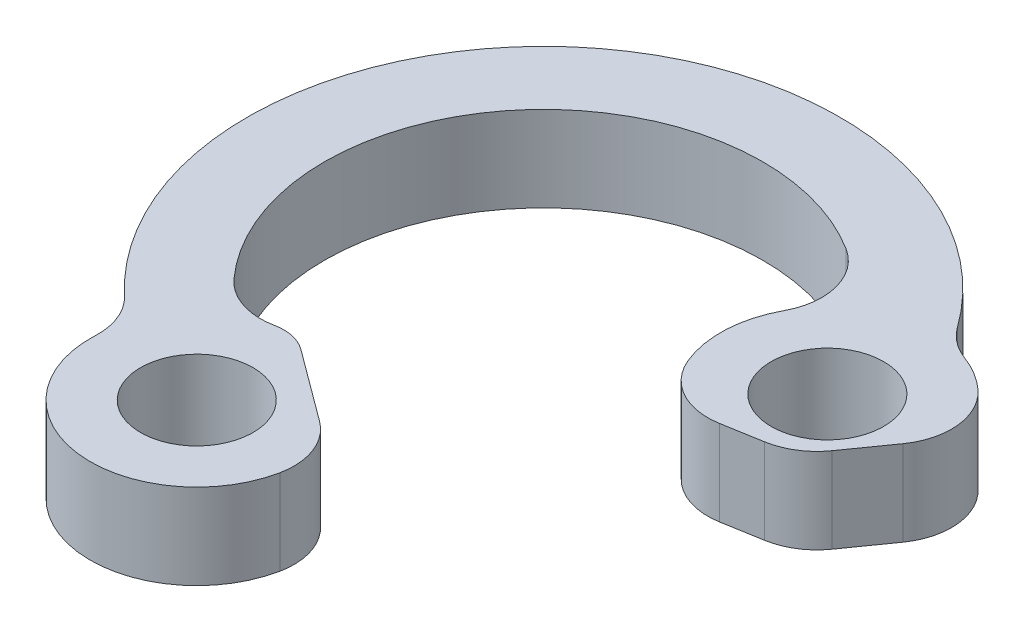
ISO-10303-21;
HEADER;
FILE_DESCRIPTION(('STEP AP214'),'2;1');
FILE_NAME('part.step','',(''),(''),'','','');
FILE_SCHEMA(('AUTOMOTIVE_DESIGN { 1 0 10303 214 1 1 1 1 }'));
ENDSEC;
DATA;
#1=APPLICATION_CONTEXT('core data for automotive mechanical design processes');
#2=APPLICATION_PROTOCOL_DEFINITION('international standard','automotive_design',2000,#1);
#3=PRODUCT_CONTEXT('',#1,'mechanical');
#4=PRODUCT('Part','Part','',(#3));
#5=PRODUCT_RELATED_PRODUCT_CATEGORY('part','',(#4));
#6=PRODUCT_DEFINITION_FORMATION('','',#4);
#7=PRODUCT_DEFINITION_CONTEXT('part definition',#1,'design');
#8=PRODUCT_DEFINITION('design','',#6,#7);
#9=PRODUCT_DEFINITION_SHAPE('','',#8);
#10=(LENGTH_UNIT() NAMED_UNIT(*) SI_UNIT(.MILLI.,.METRE.));
#11=(NAMED_UNIT(*) PLANE_ANGLE_UNIT() SI_UNIT($,.RADIAN.));
#12=(NAMED_UNIT(*) SI_UNIT($,.STERADIAN.) SOLID_ANGLE_UNIT());
#13=UNCERTAINTY_MEASURE_WITH_UNIT(LENGTH_MEASURE(1.E-05),#10,'distance_accuracy_value','');
#14=(GEOMETRIC_REPRESENTATION_CONTEXT(3) GLOBAL_UNCERTAINTY_ASSIGNED_CONTEXT((#13)) GLOBAL_UNIT_ASSIGNED_CONTEXT((#10,
#11,#12)) REPRESENTATION_CONTEXT('',''));
#15=CARTESIAN_POINT('',(0.,0.,0.));
#16=DIRECTION('',(0.,0.,1.));
#17=DIRECTION('',(1.,0.,0.));
#18=AXIS2_PLACEMENT_3D('',#15,#16,#17);
#19=CARTESIAN_POINT('',(70.7257143841729,0.,-73.8122286185501));
#20=DIRECTION('',(0.,1.,0.));
#21=DIRECTION('',(0.,0.,1.));
#22=AXIS2_PLACEMENT_3D('',#19,#20,#21);
#23=CYLINDRICAL_SURFACE('',#22,3.);
#24=CARTESIAN_POINT('',(70.7257143841729,4.,-73.8122286185501));
#25=DIRECTION('',(0.,-1.,0.));
#26=DIRECTION('',(0.,0.,-1.));
#27=AXIS2_PLACEMENT_3D('',#24,#25,#26);
#28=CIRCLE('',#27,3.);
#29=CARTESIAN_POINT('',(71.3263935959705,4.,-70.872979652485));
#30=VERTEX_POINT('',#29);
#31=CARTESIAN_POINT('',(68.4970170332679,4.,-71.8040184407876));
#32=VERTEX_POINT('',#31);
#33=EDGE_CURVE('E184',#30,#32,#28,.T.);
#34=ORIENTED_EDGE('',*,*,#33,.F.);
#35=DIRECTION('',(0.,1.,0.));
#36=VECTOR('',#35,1.);
#37=CARTESIAN_POINT('',(71.3263935959705,0.,-70.872979652485));
#38=LINE('',#37,#36);
#39=CARTESIAN_POINT('',(71.3263935959705,0.,-70.872979652485));
#40=VERTEX_POINT('',#39);
#41=EDGE_CURVE('E11',#40,#30,#38,.T.);
#42=ORIENTED_EDGE('',*,*,#41,.F.);
#43=CARTESIAN_POINT('',(70.7257143841729,0.,-73.8122286185501));
#44=DIRECTION('',(0.,-1.,0.));
#45=DIRECTION('',(0.,0.,-1.));
#46=AXIS2_PLACEMENT_3D('',#43,#44,#45);
#47=CIRCLE('',#46,3.);
#48=CARTESIAN_POINT('',(68.4970170332679,0.,-71.8040184407876));
#49=VERTEX_POINT('',#48);
#50=EDGE_CURVE('E232',#40,#49,#47,.T.);
#51=ORIENTED_EDGE('',*,*,#50,.T.);
#52=DIRECTION('',(0.,1.,0.));
#53=VECTOR('',#52,1.);
#54=CARTESIAN_POINT('',(68.4970170332679,0.,-71.8040184407876));
#55=LINE('',#54,#53);
#56=EDGE_CURVE('E36',#49,#32,#55,.T.);
#57=ORIENTED_EDGE('',*,*,#56,.T.);
#58=EDGE_LOOP('',(#34,#42,#51,#57));
#59=FACE_BOUND('',#58,.T.);
#60=ADVANCED_FACE('F33',(#59),#23,.F.);
#61=CARTESIAN_POINT('',(71.7268464038356,0.,-68.913480341775));
#62=DIRECTION('',(0.,1.,0.));
#63=DIRECTION('',(0.,0.,1.));
#64=AXIS2_PLACEMENT_3D('',#61,#62,#63);
#65=CYLINDRICAL_SURFACE('',#64,2.);
#66=CARTESIAN_POINT('',(71.7268464038356,4.,-68.913480341775));
#67=DIRECTION('',(0.,1.,0.));
#68=DIRECTION('',(0.,0.,1.));
#69=AXIS2_PLACEMENT_3D('',#66,#67,#68);
#70=CIRCLE('',#69,2.);
#71=CARTESIAN_POINT('',(72.9156523362013,4.,-70.5218150255931));
#72=VERTEX_POINT('',#71);
#73=EDGE_CURVE('E230',#72,#30,#70,.T.);
#74=ORIENTED_EDGE('',*,*,#73,.F.);
#75=DIRECTION('',(0.,1.,0.));
#76=VECTOR('',#75,1.);
#77=CARTESIAN_POINT('',(72.9156523362013,0.,-70.5218150255931));
#78=LINE('',#77,#76);
#79=CARTESIAN_POINT('',(72.9156523362013,0.,-70.5218150255931));
#80=VERTEX_POINT('',#79);
#81=EDGE_CURVE('E42',#80,#72,#78,.T.);
#82=ORIENTED_EDGE('',*,*,#81,.F.);
#83=CARTESIAN_POINT('',(71.7268464038356,0.,-68.913480341775));
#84=DIRECTION('',(0.,1.,0.));
#85=DIRECTION('',(0.,0.,1.));
#86=AXIS2_PLACEMENT_3D('',#83,#84,#85);
#87=CIRCLE('',#86,2.);
#88=EDGE_CURVE('E174',#80,#40,#87,.T.);
#89=ORIENTED_EDGE('',*,*,#88,.T.);
#90=ORIENTED_EDGE('',*,*,#41,.T.);
#91=EDGE_LOOP('',(#74,#82,#89,#90));
#92=FACE_BOUND('',#91,.T.);
#93=ADVANCED_FACE('F262',(#92),#65,.T.);
#94=CARTESIAN_POINT('',(76.2816528178536,0.,-68.0338245711221));
#95=DIRECTION('',(0.594402966182842,0.,-0.804167341909033));
#96=DIRECTION('',(-0.804167341909033,0.,-0.594402966182842));
#97=AXIS2_PLACEMENT_3D('',#94,#95,#96);
#98=PLANE('',#97);
#99=DIRECTION('',(-0.804167341909033,0.,-0.594402966182842));
#100=VECTOR('',#99,1.);
#101=CARTESIAN_POINT('',(76.2816528178536,4.,-68.0338245711221));
#102=LINE('',#101,#100);
#103=CARTESIAN_POINT('',(76.2816528178536,4.,-68.0338245711221));
#104=VERTEX_POINT('',#103);
#105=EDGE_CURVE('E161',#104,#72,#102,.T.);
#106=ORIENTED_EDGE('',*,*,#105,.F.);
#107=DIRECTION('',(0.,1.,0.));
#108=VECTOR('',#107,1.);
#109=CARTESIAN_POINT('',(76.2816528178536,0.,-68.0338245711221));
#110=LINE('',#109,#108);
#111=CARTESIAN_POINT('',(76.2816528178536,0.,-68.0338245711221));
#112=VERTEX_POINT('',#111);
#113=EDGE_CURVE('E156',#112,#104,#110,.T.);
#114=ORIENTED_EDGE('',*,*,#113,.F.);
#115=DIRECTION('',(-0.804167341909033,0.,-0.594402966182842));
#116=VECTOR('',#115,1.);
#117=CARTESIAN_POINT('',(76.2816528178536,0.,-68.0338245711221));
#118=LINE('',#117,#116);
#119=EDGE_CURVE('E159',#112,#80,#118,.T.);
#120=ORIENTED_EDGE('',*,*,#119,.T.);
#121=ORIENTED_EDGE('',*,*,#81,.T.);
#122=EDGE_LOOP('',(#106,#114,#120,#121));
#123=FACE_BOUND('',#122,.T.);
#124=ADVANCED_FACE('F158',(#123),#98,.T.);
#125=CARTESIAN_POINT('',(74.4984439193051,0.,-65.621322545395));
#126=DIRECTION('',(0.,1.,0.));
#127=DIRECTION('',(0.,0.,1.));
#128=AXIS2_PLACEMENT_3D('',#125,#126,#127);
#129=CYLINDRICAL_SURFACE('',#128,3.);
#130=CARTESIAN_POINT('',(74.4984439193051,4.,-65.621322545395));
#131=DIRECTION('',(0.,1.,0.));
#132=DIRECTION('',(0.,0.,1.));
#133=AXIS2_PLACEMENT_3D('',#130,#131,#132);
#134=CIRCLE('',#133,3.);
#135=CARTESIAN_POINT('',(77.4381265050103,4.,-65.0227690429395));
#136=VERTEX_POINT('',#135);
#137=EDGE_CURVE('E227',#136,#104,#134,.T.);
#138=ORIENTED_EDGE('',*,*,#137,.F.);
#139=DIRECTION('',(0.,1.,0.));
#140=VECTOR('',#139,1.);
#141=CARTESIAN_POINT('',(77.4381265050103,0.,-65.0227690429395));
#142=LINE('',#141,#140);
#143=CARTESIAN_POINT('',(77.4381265050103,0.,-65.0227690429395));
#144=VERTEX_POINT('',#143);
#145=EDGE_CURVE('E166',#144,#136,#142,.T.);
#146=ORIENTED_EDGE('',*,*,#145,.F.);
#147=CARTESIAN_POINT('',(74.4984439193051,0.,-65.621322545395));
#148=DIRECTION('',(0.,1.,0.));
#149=DIRECTION('',(0.,0.,1.));
#150=AXIS2_PLACEMENT_3D('',#147,#148,#149);
#151=CIRCLE('',#150,3.);
#152=EDGE_CURVE('E172',#144,#112,#151,.T.);
#153=ORIENTED_EDGE('',*,*,#152,.T.);
#154=ORIENTED_EDGE('',*,*,#113,.T.);
#155=EDGE_LOOP('',(#138,#146,#153,#154));
#156=FACE_BOUND('',#155,.T.);
#157=ADVANCED_FACE('F176',(#156),#129,.T.);
#158=CARTESIAN_POINT('',(72.5386555288346,0.,-66.0203582136987));
#159=DIRECTION('',(0.,1.,0.));
#160=DIRECTION('',(0.,0.,1.));
#161=AXIS2_PLACEMENT_3D('',#158,#159,#160);
#162=CYLINDRICAL_SURFACE('',#161,5.00000000000039);
#163=CARTESIAN_POINT('',(72.5386555288346,4.,-66.0203582136987));
#164=DIRECTION('',(0.,1.,0.));
#165=DIRECTION('',(0.,0.,1.));
#166=AXIS2_PLACEMENT_3D('',#163,#164,#165);
#167=CIRCLE('',#166,5.00000000000039);
#168=CARTESIAN_POINT('',(67.5438448545859,4.,-66.2481000157799));
#169=VERTEX_POINT('',#168);
#170=EDGE_CURVE('E224',#169,#136,#167,.T.);
#171=ORIENTED_EDGE('',*,*,#170,.F.);
#172=DIRECTION('',(0.,1.,0.));
#173=VECTOR('',#172,1.);
#174=CARTESIAN_POINT('',(67.5438448545859,0.,-66.2481000157799));
#175=LINE('',#174,#173);
#176=CARTESIAN_POINT('',(67.5438448545859,0.,-66.2481000157799));
#177=VERTEX_POINT('',#176);
#178=EDGE_CURVE('E236',#177,#169,#175,.T.);
#179=ORIENTED_EDGE('',*,*,#178,.F.);
#180=CARTESIAN_POINT('',(72.5386555288346,0.,-66.0203582136987));
#181=DIRECTION('',(0.,1.,0.));
#182=DIRECTION('',(0.,0.,1.));
#183=AXIS2_PLACEMENT_3D('',#180,#181,#182);
#184=CIRCLE('',#183,5.00000000000039);
#185=EDGE_CURVE('E177',#177,#144,#184,.T.);
#186=ORIENTED_EDGE('',*,*,#185,.T.);
#187=ORIENTED_EDGE('',*,*,#145,.T.);
#188=EDGE_LOOP('',(#171,#179,#186,#187));
#189=FACE_BOUND('',#188,.T.);
#190=ADVANCED_FACE('F275',(#189),#162,.T.);
#191=CARTESIAN_POINT('',(64.5469584500369,0.,-66.3847450970286));
#192=DIRECTION('',(0.,1.,0.));
#193=DIRECTION('',(0.,0.,1.));
#194=AXIS2_PLACEMENT_3D('',#191,#192,#193);
#195=CYLINDRICAL_SURFACE('',#194,3.);
#196=CARTESIAN_POINT('',(64.5469584500369,4.,-66.3847450970286));
#197=DIRECTION('',(0.,-1.,0.));
#198=DIRECTION('',(0.,0.,-1.));
#199=AXIS2_PLACEMENT_3D('',#196,#197,#198);
#200=CIRCLE('',#199,3.);
#201=CARTESIAN_POINT('',(66.6039727055924,4.,-68.5684786779494));
#202=VERTEX_POINT('',#201);
#203=EDGE_CURVE('E221',#202,#169,#200,.T.);
#204=ORIENTED_EDGE('',*,*,#203,.F.);
#205=DIRECTION('',(0.,1.,0.));
#206=VECTOR('',#205,1.);
#207=CARTESIAN_POINT('',(66.6039727055924,0.,-68.5684786779494));
#208=LINE('',#207,#206);
#209=CARTESIAN_POINT('',(66.6039727055924,0.,-68.5684786779494));
#210=VERTEX_POINT('',#209);
#211=EDGE_CURVE('E238',#210,#202,#208,.T.);
#212=ORIENTED_EDGE('',*,*,#211,.F.);
#213=CARTESIAN_POINT('',(64.5469584500369,0.,-66.3847450970286));
#214=DIRECTION('',(0.,-1.,0.));
#215=DIRECTION('',(0.,0.,-1.));
#216=AXIS2_PLACEMENT_3D('',#213,#214,#215);
#217=CIRCLE('',#216,3.);
#218=EDGE_CURVE('E179',#210,#177,#217,.T.);
#219=ORIENTED_EDGE('',*,*,#218,.T.);
#220=ORIENTED_EDGE('',*,*,#178,.T.);
#221=EDGE_LOOP('',(#204,#212,#219,#220));
#222=FACE_BOUND('',#221,.T.);
#223=ADVANCED_FACE('F278',(#222),#195,.F.);
#224=CARTESIAN_POINT('',(76.133240695646,0.,-78.6847831494777));
#225=DIRECTION('',(0.,1.,0.));
#226=DIRECTION('',(0.,0.,1.));
#227=AXIS2_PLACEMENT_3D('',#224,#225,#226);
#228=CYLINDRICAL_SURFACE('',#227,13.8977179632817);
#229=CARTESIAN_POINT('',(76.133240695646,4.,-78.6847831494777));
#230=DIRECTION('',(0.,1.,0.));
#231=DIRECTION('',(0.,0.,1.));
#232=AXIS2_PLACEMENT_3D('',#229,#230,#231);
#233=CIRCLE('',#232,13.8977179632817);
#234=CARTESIAN_POINT('',(87.417993221366,4.,-86.7965600830589));
#235=VERTEX_POINT('',#234);
#236=EDGE_CURVE('E218',#235,#202,#233,.T.);
#237=ORIENTED_EDGE('',*,*,#236,.F.);
#238=DIRECTION('',(0.,1.,0.));
#239=VECTOR('',#238,1.);
#240=CARTESIAN_POINT('',(87.417993221366,0.,-86.7965600830589));
#241=LINE('',#240,#239);
#242=CARTESIAN_POINT('',(87.417993221366,0.,-86.7965600830589));
#243=VERTEX_POINT('',#242);
#244=EDGE_CURVE('E240',#243,#235,#241,.T.);
#245=ORIENTED_EDGE('',*,*,#244,.F.);
#246=CARTESIAN_POINT('',(76.133240695646,0.,-78.6847831494777));
#247=DIRECTION('',(0.,1.,0.));
#248=DIRECTION('',(0.,0.,1.));
#249=AXIS2_PLACEMENT_3D('',#246,#247,#248);
#250=CIRCLE('',#249,13.8977179632817);
#251=EDGE_CURVE('E387',#243,#210,#250,.T.);
#252=ORIENTED_EDGE('',*,*,#251,.T.);
#253=ORIENTED_EDGE('',*,*,#211,.T.);
#254=EDGE_LOOP('',(#237,#245,#252,#253));
#255=FACE_BOUND('',#254,.T.);
#256=ADVANCED_FACE('F282',(#255),#228,.T.);
#257=CARTESIAN_POINT('',(89.85395124459,0.,-88.5475907821304));
#258=DIRECTION('',(0.,1.,0.));
#259=DIRECTION('',(0.,0.,1.));
#260=AXIS2_PLACEMENT_3D('',#257,#258,#259);
#261=CYLINDRICAL_SURFACE('',#260,3.);
#262=CARTESIAN_POINT('',(89.85395124459,4.,-88.5475907821304));
#263=DIRECTION('',(0.,-1.,0.));
#264=DIRECTION('',(0.,0.,-1.));
#265=AXIS2_PLACEMENT_3D('',#262,#263,#264);
#266=CIRCLE('',#265,3.);
#267=CARTESIAN_POINT('',(88.8112972998029,4.,-85.7346078899997));
#268=VERTEX_POINT('',#267);
#269=EDGE_CURVE('E215',#268,#235,#266,.T.);
#270=ORIENTED_EDGE('',*,*,#269,.F.);
#271=DIRECTION('',(0.,1.,0.));
#272=VECTOR('',#271,1.);
#273=CARTESIAN_POINT('',(88.8112972998029,0.,-85.7346078899997));
#274=LINE('',#273,#272);
#275=CARTESIAN_POINT('',(88.8112972998029,0.,-85.7346078899997));
#276=VERTEX_POINT('',#275);
#277=EDGE_CURVE('E242',#276,#268,#274,.T.);
#278=ORIENTED_EDGE('',*,*,#277,.F.);
#279=CARTESIAN_POINT('',(89.85395124459,0.,-88.5475907821304));
#280=DIRECTION('',(0.,-1.,0.));
#281=DIRECTION('',(0.,0.,-1.));
#282=AXIS2_PLACEMENT_3D('',#279,#280,#281);
#283=CIRCLE('',#282,3.);
#284=EDGE_CURVE('E384',#276,#243,#283,.T.);
#285=ORIENTED_EDGE('',*,*,#284,.T.);
#286=ORIENTED_EDGE('',*,*,#244,.T.);
#287=EDGE_LOOP('',(#270,#278,#285,#286));
#288=FACE_BOUND('',#287,.T.);
#289=ADVANCED_FACE('F286',(#288),#261,.F.);
#290=CARTESIAN_POINT('',(87.0735407251576,0.,-81.0463030697812));
#291=DIRECTION('',(0.,1.,0.));
#292=DIRECTION('',(0.,0.,1.));
#293=AXIS2_PLACEMENT_3D('',#290,#291,#292);
#294=CYLINDRICAL_SURFACE('',#293,5.00000000000075);
#295=CARTESIAN_POINT('',(87.0735407251576,4.,-81.0463030697812));
#296=DIRECTION('',(0.,1.,0.));
#297=DIRECTION('',(0.,0.,1.));
#298=AXIS2_PLACEMENT_3D('',#295,#296,#297);
#299=CIRCLE('',#298,5.00000000000075);
#300=CARTESIAN_POINT('',(90.4170132830894,4.,-84.7639893468041));
#301=VERTEX_POINT('',#300);
#302=EDGE_CURVE('E212',#301,#268,#299,.T.);
#303=ORIENTED_EDGE('',*,*,#302,.F.);
#304=DIRECTION('',(0.,1.,0.));
#305=VECTOR('',#304,1.);
#306=CARTESIAN_POINT('',(90.4170132830894,0.,-84.7639893468041));
#307=LINE('',#306,#305);
#308=CARTESIAN_POINT('',(90.4170132830894,0.,-84.7639893468041));
#309=VERTEX_POINT('',#308);
#310=EDGE_CURVE('E244',#309,#301,#307,.T.);
#311=ORIENTED_EDGE('',*,*,#310,.F.);
#312=CARTESIAN_POINT('',(87.0735407251576,0.,-81.0463030697812));
#313=DIRECTION('',(0.,1.,0.));
#314=DIRECTION('',(0.,0.,1.));
#315=AXIS2_PLACEMENT_3D('',#312,#313,#314);
#316=CIRCLE('',#315,5.00000000000075);
#317=EDGE_CURVE('E381',#309,#276,#316,.T.);
#318=ORIENTED_EDGE('',*,*,#317,.T.);
#319=ORIENTED_EDGE('',*,*,#277,.T.);
#320=EDGE_LOOP('',(#303,#311,#318,#319));
#321=FACE_BOUND('',#320,.T.);
#322=ADVANCED_FACE('F290',(#321),#294,.T.);
#323=CARTESIAN_POINT('',(88.4109297483306,0.,-82.5333775805907));
#324=DIRECTION('',(0.,1.,0.));
#325=DIRECTION('',(0.,0.,1.));
#326=AXIS2_PLACEMENT_3D('',#323,#324,#325);
#327=CYLINDRICAL_SURFACE('',#326,3.00000000000001);
#328=CARTESIAN_POINT('',(88.4109297483306,4.,-82.5333775805907));
#329=DIRECTION('',(0.,1.,0.));
#330=DIRECTION('',(0.,0.,1.));
#331=AXIS2_PLACEMENT_3D('',#328,#329,#330);
#332=CIRCLE('',#331,3.00000000000001);
#333=CARTESIAN_POINT('',(90.8599078164376,4.,-80.8006033823955));
#334=VERTEX_POINT('',#333);
#335=EDGE_CURVE('E209',#334,#301,#332,.T.);
#336=ORIENTED_EDGE('',*,*,#335,.F.);
#337=DIRECTION('',(0.,1.,0.));
#338=VECTOR('',#337,1.);
#339=CARTESIAN_POINT('',(90.8599078164376,0.,-80.8006033823955));
#340=LINE('',#339,#338);
#341=CARTESIAN_POINT('',(90.8599078164376,0.,-80.8006033823955));
#342=VERTEX_POINT('',#341);
#343=EDGE_CURVE('E246',#342,#334,#340,.T.);
#344=ORIENTED_EDGE('',*,*,#343,.F.);
#345=CARTESIAN_POINT('',(88.4109297483306,0.,-82.5333775805907));
#346=DIRECTION('',(0.,1.,0.));
#347=DIRECTION('',(0.,0.,1.));
#348=AXIS2_PLACEMENT_3D('',#345,#346,#347);
#349=CIRCLE('',#348,3.00000000000001);
#350=EDGE_CURVE('E378',#342,#309,#349,.T.);
#351=ORIENTED_EDGE('',*,*,#350,.T.);
#352=ORIENTED_EDGE('',*,*,#310,.T.);
#353=EDGE_LOOP('',(#336,#344,#351,#352));
#354=FACE_BOUND('',#353,.T.);
#355=ADVANCED_FACE('F294',(#354),#327,.T.);
#356=CARTESIAN_POINT('',(89.4867256076961,0.,-78.8598466950986));
#357=DIRECTION('',(0.816326022702334,0.,0.577591399398389));
#358=DIRECTION('',(0.577591399398389,0.,-0.816326022702334));
#359=AXIS2_PLACEMENT_3D('',#356,#357,#358);
#360=PLANE('',#359);
#361=DIRECTION('',(0.577591399398389,0.,-0.816326022702334));
#362=VECTOR('',#361,1.);
#363=CARTESIAN_POINT('',(89.4867256076961,4.,-78.8598466950986));
#364=LINE('',#363,#362);
#365=CARTESIAN_POINT('',(89.4867256076961,4.,-78.8598466950986));
#366=VERTEX_POINT('',#365);
#367=EDGE_CURVE('E206',#366,#334,#364,.T.);
#368=ORIENTED_EDGE('',*,*,#367,.F.);
#369=DIRECTION('',(0.,1.,0.));
#370=VECTOR('',#369,1.);
#371=CARTESIAN_POINT('',(89.4867256076961,0.,-78.8598466950986));
#372=LINE('',#371,#370);
#373=CARTESIAN_POINT('',(89.4867256076961,0.,-78.8598466950986));
#374=VERTEX_POINT('',#373);
#375=EDGE_CURVE('E248',#374,#366,#372,.T.);
#376=ORIENTED_EDGE('',*,*,#375,.F.);
#377=DIRECTION('',(0.577591399398389,0.,-0.816326022702334));
#378=VECTOR('',#377,1.);
#379=CARTESIAN_POINT('',(89.4867256076961,0.,-78.8598466950986));
#380=LINE('',#379,#378);
#381=EDGE_CURVE('E375',#374,#342,#380,.T.);
#382=ORIENTED_EDGE('',*,*,#381,.T.);
#383=ORIENTED_EDGE('',*,*,#343,.T.);
#384=EDGE_LOOP('',(#368,#376,#382,#383));
#385=FACE_BOUND('',#384,.T.);
#386=ADVANCED_FACE('F298',(#385),#360,.T.);
#387=CARTESIAN_POINT('',(87.0377475395891,0.,-80.5926208932938));
#388=DIRECTION('',(0.,1.,0.));
#389=DIRECTION('',(0.,0.,1.));
#390=AXIS2_PLACEMENT_3D('',#387,#388,#389);
#391=CYLINDRICAL_SURFACE('',#390,3.);
#392=CARTESIAN_POINT('',(87.0377475395891,4.,-80.5926208932938));
#393=DIRECTION('',(0.,1.,0.));
#394=DIRECTION('',(0.,0.,1.));
#395=AXIS2_PLACEMENT_3D('',#392,#393,#394);
#396=CIRCLE('',#395,3.);
#397=CARTESIAN_POINT('',(87.5472284238912,4.,-77.636199200008));
#398=VERTEX_POINT('',#397);
#399=EDGE_CURVE('E203',#398,#366,#396,.T.);
#400=ORIENTED_EDGE('',*,*,#399,.F.);
#401=DIRECTION('',(0.,1.,0.));
#402=VECTOR('',#401,1.);
#403=CARTESIAN_POINT('',(87.5472284238912,0.,-77.636199200008));
#404=LINE('',#403,#402);
#405=CARTESIAN_POINT('',(87.5472284238912,0.,-77.636199200008));
#406=VERTEX_POINT('',#405);
#407=EDGE_CURVE('E250',#406,#398,#404,.T.);
#408=ORIENTED_EDGE('',*,*,#407,.F.);
#409=CARTESIAN_POINT('',(87.0377475395891,0.,-80.5926208932938));
#410=DIRECTION('',(0.,1.,0.));
#411=DIRECTION('',(0.,0.,1.));
#412=AXIS2_PLACEMENT_3D('',#409,#410,#411);
#413=CIRCLE('',#412,3.);
#414=EDGE_CURVE('E372',#406,#374,#413,.T.);
#415=ORIENTED_EDGE('',*,*,#414,.T.);
#416=ORIENTED_EDGE('',*,*,#375,.T.);
#417=EDGE_LOOP('',(#400,#408,#415,#416));
#418=FACE_BOUND('',#417,.T.);
#419=ADVANCED_FACE('F302',(#418),#391,.T.);
#420=CARTESIAN_POINT('',(85.7354837120089,0.,-77.3239807840643));
#421=DIRECTION('',(0.169826961434026,0.,0.985473897761928));
#422=DIRECTION('',(0.985473897761928,0.,-0.169826961434026));
#423=AXIS2_PLACEMENT_3D('',#420,#421,#422);
#424=PLANE('',#423);
#425=DIRECTION('',(0.985473897761927,0.,-0.169826961434026));
#426=VECTOR('',#425,1.);
#427=CARTESIAN_POINT('',(85.7354837120089,4.,-77.3239807840643));
#428=LINE('',#427,#426);
#429=CARTESIAN_POINT('',(85.7354837120089,4.,-77.3239807840643));
#430=VERTEX_POINT('',#429);
#431=EDGE_CURVE('E200',#430,#398,#428,.T.);
#432=ORIENTED_EDGE('',*,*,#431,.F.);
#433=DIRECTION('',(0.,1.,0.));
#434=VECTOR('',#433,1.);
#435=CARTESIAN_POINT('',(85.7354837120089,0.,-77.3239807840643));
#436=LINE('',#435,#434);
#437=CARTESIAN_POINT('',(85.7354837120089,0.,-77.3239807840643));
#438=VERTEX_POINT('',#437);
#439=EDGE_CURVE('E252',#438,#430,#436,.T.);
#440=ORIENTED_EDGE('',*,*,#439,.F.);
#441=DIRECTION('',(0.985473897761927,0.,-0.169826961434026));
#442=VECTOR('',#441,1.);
#443=CARTESIAN_POINT('',(85.7354837120089,0.,-77.3239807840643));
#444=LINE('',#443,#442);
#445=EDGE_CURVE('E369',#438,#406,#444,.T.);
#446=ORIENTED_EDGE('',*,*,#445,.T.);
#447=ORIENTED_EDGE('',*,*,#407,.T.);
#448=EDGE_LOOP('',(#432,#440,#446,#447));
#449=FACE_BOUND('',#448,.T.);
#450=ADVANCED_FACE('F306',(#449),#424,.T.);
#451=CARTESIAN_POINT('',(85.2260028277068,0.,-80.2804024773501));
#452=DIRECTION('',(0.,1.,0.));
#453=DIRECTION('',(0.,0.,1.));
#454=AXIS2_PLACEMENT_3D('',#451,#452,#453);
#455=CYLINDRICAL_SURFACE('',#454,3.);
#456=CARTESIAN_POINT('',(85.2260028277068,4.,-80.2804024773501));
#457=DIRECTION('',(0.,1.,0.));
#458=DIRECTION('',(0.,0.,1.));
#459=AXIS2_PLACEMENT_3D('',#456,#457,#458);
#460=CIRCLE('',#459,3.);
#461=CARTESIAN_POINT('',(82.4546959815318,4.,-79.1315515887038));
#462=VERTEX_POINT('',#461);
#463=EDGE_CURVE('E197',#462,#430,#460,.T.);
#464=ORIENTED_EDGE('',*,*,#463,.F.);
#465=DIRECTION('',(0.,1.,0.));
#466=VECTOR('',#465,1.);
#467=CARTESIAN_POINT('',(82.4546959815318,0.,-79.1315515887038));
#468=LINE('',#467,#466);
#469=CARTESIAN_POINT('',(82.4546959815318,0.,-79.1315515887038));
#470=VERTEX_POINT('',#469);
#471=EDGE_CURVE('E254',#470,#462,#468,.T.);
#472=ORIENTED_EDGE('',*,*,#471,.F.);
#473=CARTESIAN_POINT('',(85.2260028277068,0.,-80.2804024773501));
#474=DIRECTION('',(0.,1.,0.));
#475=DIRECTION('',(0.,0.,1.));
#476=AXIS2_PLACEMENT_3D('',#473,#474,#475);
#477=CIRCLE('',#476,3.);
#478=EDGE_CURVE('E366',#470,#438,#477,.T.);
#479=ORIENTED_EDGE('',*,*,#478,.T.);
#480=ORIENTED_EDGE('',*,*,#439,.T.);
#481=EDGE_LOOP('',(#464,#472,#479,#480));
#482=FACE_BOUND('',#481,.T.);
#483=ADVANCED_FACE('F310',(#482),#455,.T.);
#484=CARTESIAN_POINT('',(87.0735407251576,0.,-81.0463030697812));
#485=DIRECTION('',(0.,1.,0.));
#486=DIRECTION('',(0.,0.,1.));
#487=AXIS2_PLACEMENT_3D('',#484,#485,#486);
#488=CYLINDRICAL_SURFACE('',#487,5.00000000000075);
#489=CARTESIAN_POINT('',(87.0735407251576,4.,-81.0463030697812));
#490=DIRECTION('',(0.,1.,0.));
#491=DIRECTION('',(0.,0.,1.));
#492=AXIS2_PLACEMENT_3D('',#489,#490,#491);
#493=CIRCLE('',#492,5.00000000000075);
#494=CARTESIAN_POINT('',(82.6696468529793,4.,-83.4139429838302));
#495=VERTEX_POINT('',#494);
#496=EDGE_CURVE('E194',#495,#462,#493,.T.);
#497=ORIENTED_EDGE('',*,*,#496,.F.);
#498=DIRECTION('',(0.,1.,0.));
#499=VECTOR('',#498,1.);
#500=CARTESIAN_POINT('',(82.6696468529793,0.,-83.4139429838302));
#501=LINE('',#500,#499);
#502=CARTESIAN_POINT('',(82.6696468529793,0.,-83.4139429838302));
#503=VERTEX_POINT('',#502);
#504=EDGE_CURVE('E256',#503,#495,#501,.T.);
#505=ORIENTED_EDGE('',*,*,#504,.F.);
#506=CARTESIAN_POINT('',(87.0735407251576,0.,-81.0463030697812));
#507=DIRECTION('',(0.,1.,0.));
#508=DIRECTION('',(0.,0.,1.));
#509=AXIS2_PLACEMENT_3D('',#506,#507,#508);
#510=CIRCLE('',#509,5.00000000000075);
#511=EDGE_CURVE('E363',#503,#470,#510,.T.);
#512=ORIENTED_EDGE('',*,*,#511,.T.);
#513=ORIENTED_EDGE('',*,*,#471,.T.);
#514=EDGE_LOOP('',(#497,#505,#512,#513));
#515=FACE_BOUND('',#514,.T.);
#516=ADVANCED_FACE('F314',(#515),#488,.T.);
#517=CARTESIAN_POINT('',(80.0273105296727,0.,-84.8345269322593));
#518=DIRECTION('',(0.,1.,0.));
#519=DIRECTION('',(0.,0.,1.));
#520=AXIS2_PLACEMENT_3D('',#517,#518,#519);
#521=CYLINDRICAL_SURFACE('',#520,3.);
#522=CARTESIAN_POINT('',(80.0273105296727,4.,-84.8345269322593));
#523=DIRECTION('',(0.,-1.,0.));
#524=DIRECTION('',(0.,0.,-1.));
#525=AXIS2_PLACEMENT_3D('',#522,#523,#524);
#526=CIRCLE('',#525,3.);
#527=CARTESIAN_POINT('',(81.6322408847818,4.,-87.3691272074999));
#528=VERTEX_POINT('',#527);
#529=EDGE_CURVE('E191',#528,#495,#526,.T.);
#530=ORIENTED_EDGE('',*,*,#529,.F.);
#531=DIRECTION('',(0.,1.,0.));
#532=VECTOR('',#531,1.);
#533=CARTESIAN_POINT('',(81.6322408847818,0.,-87.3691272074999));
#534=LINE('',#533,#532);
#535=CARTESIAN_POINT('',(81.6322408847818,0.,-87.3691272074999));
#536=VERTEX_POINT('',#535);
#537=EDGE_CURVE('E257',#536,#528,#534,.T.);
#538=ORIENTED_EDGE('',*,*,#537,.F.);
#539=CARTESIAN_POINT('',(80.0273105296727,0.,-84.8345269322593));
#540=DIRECTION('',(0.,-1.,0.));
#541=DIRECTION('',(0.,0.,-1.));
#542=AXIS2_PLACEMENT_3D('',#539,#540,#541);
#543=CIRCLE('',#542,3.);
#544=EDGE_CURVE('E360',#536,#503,#543,.T.);
#545=ORIENTED_EDGE('',*,*,#544,.T.);
#546=ORIENTED_EDGE('',*,*,#504,.T.);
#547=EDGE_LOOP('',(#530,#538,#545,#546));
#548=FACE_BOUND('',#547,.T.);
#549=ADVANCED_FACE('F318',(#548),#521,.F.);
#550=CARTESIAN_POINT('',(76.133240695646,0.,-78.6847831494777));
#551=DIRECTION('',(0.,1.,0.));
#552=DIRECTION('',(0.,0.,1.));
#553=AXIS2_PLACEMENT_3D('',#550,#551,#552);
#554=CYLINDRICAL_SURFACE('',#553,10.278951055347);
#555=CARTESIAN_POINT('',(76.133240695646,4.,-78.6847831494777));
#556=DIRECTION('',(0.,-1.,0.));
#557=DIRECTION('',(0.,0.,-1.));
#558=AXIS2_PLACEMENT_3D('',#555,#556,#557);
#559=CIRCLE('',#558,10.278951055347);
#560=EDGE_CURVE('E187',#32,#528,#559,.T.);
#561=ORIENTED_EDGE('',*,*,#560,.F.);
#562=ORIENTED_EDGE('',*,*,#56,.F.);
#563=CARTESIAN_POINT('',(76.133240695646,0.,-78.6847831494777));
#564=DIRECTION('',(0.,-1.,0.));
#565=DIRECTION('',(0.,0.,-1.));
#566=AXIS2_PLACEMENT_3D('',#563,#564,#565);
#567=CIRCLE('',#566,10.278951055347);
#568=EDGE_CURVE('E358',#49,#536,#567,.T.);
#569=ORIENTED_EDGE('',*,*,#568,.T.);
#570=ORIENTED_EDGE('',*,*,#537,.T.);
#571=EDGE_LOOP('',(#561,#562,#569,#570));
#572=FACE_BOUND('',#571,.T.);
#573=ADVANCED_FACE('F259',(#572),#554,.F.);
#574=CARTESIAN_POINT('',(70.7257143841729,0.,-73.8122286185501));
#575=DIRECTION('',(0.,-1.,0.));
#576=DIRECTION('',(0.,0.,-1.));
#577=AXIS2_PLACEMENT_3D('',#574,#575,#576);
#578=PLANE('',#577);
#579=CARTESIAN_POINT('',(87.0735407251576,0.,-81.0463030697812));
#580=DIRECTION('',(0.,1.,0.));
#581=DIRECTION('',(0.,0.,-1.));
#582=AXIS2_PLACEMENT_3D('',#579,#580,#581);
#583=CIRCLE('',#582,2.6375);
#584=CARTESIAN_POINT('',(87.0735407251576,0.,-83.6838030697812));
#585=VERTEX_POINT('',#584);
#586=EDGE_CURVE('E345',#585,#585,#583,.T.);
#587=ORIENTED_EDGE('',*,*,#586,.T.);
#588=EDGE_LOOP('',(#587));
#589=FACE_BOUND('',#588,.T.);
#590=CARTESIAN_POINT('',(72.5386555288346,0.,-66.0203582136987));
#591=DIRECTION('',(0.,1.,0.));
#592=DIRECTION('',(0.,0.,-1.));
#593=AXIS2_PLACEMENT_3D('',#590,#591,#592);
#594=CIRCLE('',#593,2.6375);
#595=CARTESIAN_POINT('',(72.5386555288346,0.,-68.6578582136987));
#596=VERTEX_POINT('',#595);
#597=EDGE_CURVE('E188',#596,#596,#594,.T.);
#598=ORIENTED_EDGE('',*,*,#597,.T.);
#599=EDGE_LOOP('',(#598));
#600=FACE_BOUND('',#599,.T.);
#601=ORIENTED_EDGE('',*,*,#50,.F.);
#602=ORIENTED_EDGE('',*,*,#88,.F.);
#603=ORIENTED_EDGE('',*,*,#119,.F.);
#604=ORIENTED_EDGE('',*,*,#152,.F.);
#605=ORIENTED_EDGE('',*,*,#185,.F.);
#606=ORIENTED_EDGE('',*,*,#218,.F.);
#607=ORIENTED_EDGE('',*,*,#251,.F.);
#608=ORIENTED_EDGE('',*,*,#284,.F.);
#609=ORIENTED_EDGE('',*,*,#317,.F.);
#610=ORIENTED_EDGE('',*,*,#350,.F.);
#611=ORIENTED_EDGE('',*,*,#381,.F.);
#612=ORIENTED_EDGE('',*,*,#414,.F.);
#613=ORIENTED_EDGE('',*,*,#445,.F.);
#614=ORIENTED_EDGE('',*,*,#478,.F.);
#615=ORIENTED_EDGE('',*,*,#511,.F.);
#616=ORIENTED_EDGE('',*,*,#544,.F.);
#617=ORIENTED_EDGE('',*,*,#568,.F.);
#618=EDGE_LOOP('',(#601,#602,#603,#604,#605,#606,#607,#608,#609,#610,#611,#612,#613,#614,#615,
#616,#617));
#619=FACE_BOUND('',#618,.T.);
#620=ADVANCED_FACE('F170',(#589,#600,#619),#578,.T.);
#621=CARTESIAN_POINT('',(70.7257143841729,4.,-73.8122286185501));
#622=DIRECTION('',(0.,-1.,0.));
#623=DIRECTION('',(0.,0.,-1.));
#624=AXIS2_PLACEMENT_3D('',#621,#622,#623);
#625=PLANE('',#624);
#626=CARTESIAN_POINT('',(87.0735407251576,4.,-81.0463030697812));
#627=DIRECTION('',(0.,1.,0.));
#628=DIRECTION('',(0.,0.,-1.));
#629=AXIS2_PLACEMENT_3D('',#626,#627,#628);
#630=CIRCLE('',#629,2.6375);
#631=CARTESIAN_POINT('',(87.0735407251576,4.,-83.6838030697812));
#632=VERTEX_POINT('',#631);
#633=EDGE_CURVE('E348',#632,#632,#630,.T.);
#634=ORIENTED_EDGE('',*,*,#633,.F.);
#635=EDGE_LOOP('',(#634));
#636=FACE_BOUND('',#635,.T.);
#637=CARTESIAN_POINT('',(72.5386555288346,4.,-66.0203582136987));
#638=DIRECTION('',(0.,1.,0.));
#639=DIRECTION('',(0.,0.,-1.));
#640=AXIS2_PLACEMENT_3D('',#637,#638,#639);
#641=CIRCLE('',#640,2.6375);
#642=CARTESIAN_POINT('',(72.5386555288346,4.,-68.6578582136987));
#643=VERTEX_POINT('',#642);
#644=EDGE_CURVE('E350',#643,#643,#641,.T.);
#645=ORIENTED_EDGE('',*,*,#644,.F.);
#646=EDGE_LOOP('',(#645));
#647=FACE_BOUND('',#646,.T.);
#648=ORIENTED_EDGE('',*,*,#33,.T.);
#649=ORIENTED_EDGE('',*,*,#560,.T.);
#650=ORIENTED_EDGE('',*,*,#529,.T.);
#651=ORIENTED_EDGE('',*,*,#496,.T.);
#652=ORIENTED_EDGE('',*,*,#463,.T.);
#653=ORIENTED_EDGE('',*,*,#431,.T.);
#654=ORIENTED_EDGE('',*,*,#399,.T.);
#655=ORIENTED_EDGE('',*,*,#367,.T.);
#656=ORIENTED_EDGE('',*,*,#335,.T.);
#657=ORIENTED_EDGE('',*,*,#302,.T.);
#658=ORIENTED_EDGE('',*,*,#269,.T.);
#659=ORIENTED_EDGE('',*,*,#236,.T.);
#660=ORIENTED_EDGE('',*,*,#203,.T.);
#661=ORIENTED_EDGE('',*,*,#170,.T.);
#662=ORIENTED_EDGE('',*,*,#137,.T.);
#663=ORIENTED_EDGE('',*,*,#105,.T.);
#664=ORIENTED_EDGE('',*,*,#73,.T.);
#665=EDGE_LOOP('',(#648,#649,#650,#651,#652,#653,#654,#655,#656,#657,#658,#659,#660,#661,#662,
#663,#664));
#666=FACE_BOUND('',#665,.T.);
#667=ADVANCED_FACE('F261',(#636,#647,#666),#625,.F.);
#668=CARTESIAN_POINT('',(72.5386555288346,0.,-66.0203582136987));
#669=DIRECTION('',(0.,1.,0.));
#670=DIRECTION('',(0.,0.,1.));
#671=AXIS2_PLACEMENT_3D('',#668,#669,#670);
#672=CYLINDRICAL_SURFACE('',#671,2.6375);
#673=ORIENTED_EDGE('',*,*,#597,.F.);
#674=EDGE_LOOP('',(#673));
#675=FACE_BOUND('',#674,.T.);
#676=ORIENTED_EDGE('',*,*,#644,.T.);
#677=EDGE_LOOP('',(#676));
#678=FACE_BOUND('',#677,.T.);
#679=ADVANCED_FACE('F330',(#675,#678),#672,.F.);
#680=CARTESIAN_POINT('',(87.0735407251576,0.,-81.0463030697812));
#681=DIRECTION('',(0.,1.,0.));
#682=DIRECTION('',(0.,0.,1.));
#683=AXIS2_PLACEMENT_3D('',#680,#681,#682);
#684=CYLINDRICAL_SURFACE('',#683,2.6375);
#685=ORIENTED_EDGE('',*,*,#586,.F.);
#686=EDGE_LOOP('',(#685));
#687=FACE_BOUND('',#686,.T.);
#688=ORIENTED_EDGE('',*,*,#633,.T.);
#689=EDGE_LOOP('',(#688));
#690=FACE_BOUND('',#689,.T.);
#691=ADVANCED_FACE('F337',(#687,#690),#684,.F.);
#692=CLOSED_SHELL('',(#60,#93,#124,#157,#190,#223,#256,#289,#322,#355,#386,#419,#450,#483,#516,
#549,#573,#620,#667,#679,#691));
#693=MANIFOLD_SOLID_BREP('B2',#692);
#694=ADVANCED_BREP_SHAPE_REPRESENTATION('',(#18,#693),#14);
#695=SHAPE_DEFINITION_REPRESENTATION(#9,#694);
ENDSEC;
END-ISO-10303-21;
